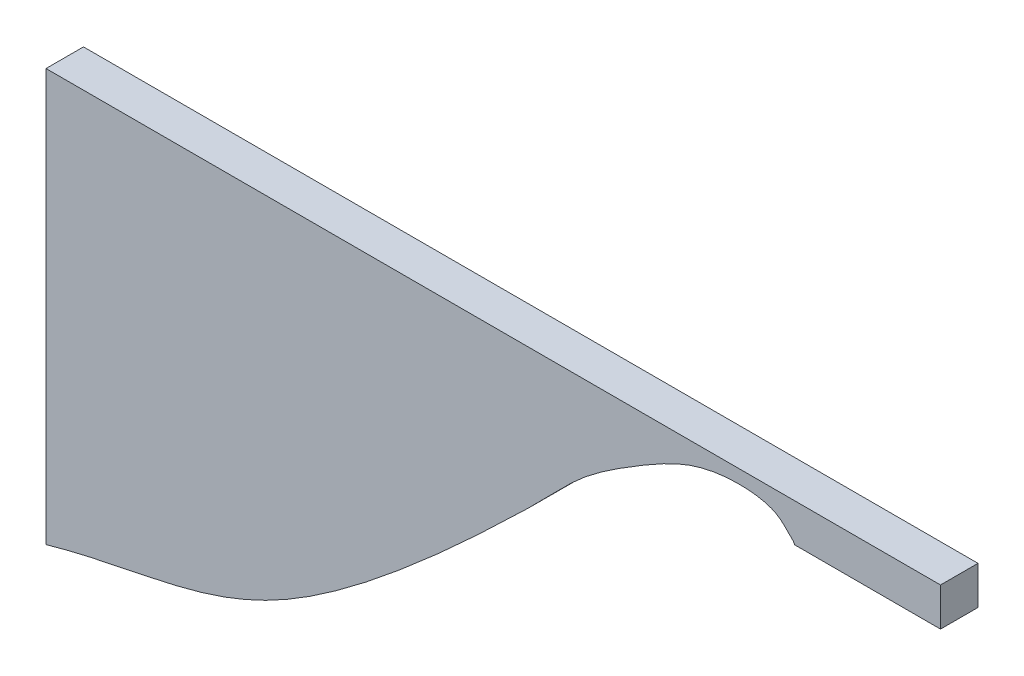
ISO-10303-21;
HEADER;
FILE_DESCRIPTION(('STEP AP214'),'2;1');
FILE_NAME('part.step','',(''),(''),'','','');
FILE_SCHEMA(('AUTOMOTIVE_DESIGN { 1 0 10303 214 1 1 1 1 }'));
ENDSEC;
DATA;
#1=APPLICATION_CONTEXT('core data for automotive mechanical design processes');
#2=APPLICATION_PROTOCOL_DEFINITION('international standard','automotive_design',2000,#1);
#3=PRODUCT_CONTEXT('',#1,'mechanical');
#4=PRODUCT('Part','Part','',(#3));
#5=PRODUCT_RELATED_PRODUCT_CATEGORY('part','',(#4));
#6=PRODUCT_DEFINITION_FORMATION('','',#4);
#7=PRODUCT_DEFINITION_CONTEXT('part definition',#1,'design');
#8=PRODUCT_DEFINITION('design','',#6,#7);
#9=PRODUCT_DEFINITION_SHAPE('','',#8);
#10=(LENGTH_UNIT() NAMED_UNIT(*) SI_UNIT(.MILLI.,.METRE.));
#11=(NAMED_UNIT(*) PLANE_ANGLE_UNIT() SI_UNIT($,.RADIAN.));
#12=(NAMED_UNIT(*) SI_UNIT($,.STERADIAN.) SOLID_ANGLE_UNIT());
#13=UNCERTAINTY_MEASURE_WITH_UNIT(LENGTH_MEASURE(1.E-05),#10,'distance_accuracy_value','');
#14=(GEOMETRIC_REPRESENTATION_CONTEXT(3) GLOBAL_UNCERTAINTY_ASSIGNED_CONTEXT((#13)) GLOBAL_UNIT_ASSIGNED_CONTEXT((#10,
#11,#12)) REPRESENTATION_CONTEXT('',''));
#15=CARTESIAN_POINT('',(0.,0.,0.));
#16=DIRECTION('',(0.,0.,1.));
#17=DIRECTION('',(1.,0.,0.));
#18=AXIS2_PLACEMENT_3D('',#15,#16,#17);
#19=CARTESIAN_POINT('',(20.559319102025,-41.7421375387278,75.9999999999997));
#20=CARTESIAN_POINT('',(20.6006217074475,-41.7303190899375,75.9999999999997));
#21=CARTESIAN_POINT('',(21.7372151884388,-41.4050908939655,75.9999999999997));
#22=CARTESIAN_POINT('',(23.9878346063018,-40.8228717307845,75.9999999999997));
#23=CARTESIAN_POINT('',(27.332073717808,-40.0909105868522,75.9999999999997));
#24=CARTESIAN_POINT('',(30.6910535632036,-39.4199065291348,75.9999999999997));
#25=CARTESIAN_POINT('',(33.4844463004313,-38.8300274329495,75.9999999999997));
#26=CARTESIAN_POINT('',(35.7012000162141,-38.2811197649488,75.9999999999997));
#27=CARTESIAN_POINT('',(37.9037494841531,-37.6635601670309,75.9999999999997));
#28=CARTESIAN_POINT('',(40.6078381788096,-36.7385237134709,75.9999999999997));
#29=CARTESIAN_POINT('',(43.7320659176392,-35.3550841305682,75.9999999999997));
#30=CARTESIAN_POINT('',(46.716341148628,-33.7303807225645,75.9999999999997));
#31=CARTESIAN_POINT('',(49.5743602868591,-31.9103389123185,75.9999999999997));
#32=CARTESIAN_POINT('',(52.3250104799769,-29.9612302924692,75.9999999999997));
#33=CARTESIAN_POINT('',(55.0253311147116,-27.8960074751916,75.9999999999997));
#34=CARTESIAN_POINT('',(57.6578897311373,-25.7609060268177,75.9999999999997));
#35=CARTESIAN_POINT('',(60.2703611817067,-23.540808031123,75.9999999999997));
#36=CARTESIAN_POINT('',(62.8206808546076,-21.2915983091942,75.9999999999997));
#37=CARTESIAN_POINT('',(65.3550419056114,-18.9883917300035,75.9999999999997));
#38=CARTESIAN_POINT('',(67.8417861936755,-16.6569401111582,75.9999999999997));
#39=CARTESIAN_POINT('',(70.3094579321987,-14.2943055515112,75.9999999999997));
#40=CARTESIAN_POINT('',(72.3581708472179,-12.3263559988564,75.9999999999997));
#41=CARTESIAN_POINT('',(73.9597288144003,-10.7134434786912,75.9999999999997));
#42=CARTESIAN_POINT('',(75.1420650382193,-9.48522361817299,75.9999999999997));
#43=CARTESIAN_POINT('',(76.1602599107097,-8.45200495256033,75.9999999999997));
#44=CARTESIAN_POINT('',(76.985126520713,-7.66991871319961,75.9999999999997));
#45=CARTESIAN_POINT('',(77.8365190180743,-6.91485000476222,75.9999999999997));
#46=CARTESIAN_POINT('',(78.9226177182861,-6.0400686966784,75.9999999999997));
#47=CARTESIAN_POINT('',(80.3127703908304,-5.04209480654106,75.9999999999997));
#48=CARTESIAN_POINT('',(81.7366435944141,-4.09984776240556,75.9999999999997));
#49=CARTESIAN_POINT('',(83.1791674923838,-3.1958957250793,75.9999999999997));
#50=CARTESIAN_POINT('',(84.6389909028154,-2.32327616364218,75.9999999999997));
#51=CARTESIAN_POINT('',(86.1167770611684,-1.48257705377303,75.9999999999997));
#52=CARTESIAN_POINT('',(87.6392489200758,-0.708072310431518,75.9999999999997));
#53=CARTESIAN_POINT('',(89.2189867414603,-0.0451010088743042,75.9999999999997));
#54=CARTESIAN_POINT('',(90.8670540227582,0.447543293336105,75.9999999999997));
#55=CARTESIAN_POINT('',(92.382394739987,0.709762770220839,75.9999999999997));
#56=CARTESIAN_POINT('',(93.7205904325718,0.823687266015985,75.9999999999997));
#57=CARTESIAN_POINT('',(94.86601460398,0.837907414862253,75.9999999999997));
#58=CARTESIAN_POINT('',(95.9052708510849,0.778478690490748,75.9999999999997));
#59=CARTESIAN_POINT('',(96.8423579537299,0.635582104006774,75.9999999999997));
#60=CARTESIAN_POINT('',(97.5785300541203,0.45866906976938,75.9999999999997));
#61=CARTESIAN_POINT('',(98.1994500099631,0.2263738790157,75.9999999999997));
#62=CARTESIAN_POINT('',(98.7059154621831,-0.0479029974733704,75.9999999999997));
#63=CARTESIAN_POINT('',(99.1245541376563,-0.384716253579125,75.9999999999997));
#64=CARTESIAN_POINT('',(99.4817263203403,-0.719519057276923,75.9999999999997));
#65=CARTESIAN_POINT('',(99.7877236757893,-1.0303144703227,75.9999999999997));
#66=CARTESIAN_POINT('',(100.10194671776,-1.33060624840962,75.9999999999997));
#67=CARTESIAN_POINT('',(100.316420526201,-1.56342967810508,75.9999999999997));
#68=CARTESIAN_POINT('',(100.419563255563,-1.73601542859504,75.9999999999997));
#69=CARTESIAN_POINT('',(100.443760155518,-1.78805572099269,75.9999999999997));
#70=CARTESIAN_POINT('',(100.457876590483,-1.81841594914382,75.9999999999997));
#71=B_SPLINE_CURVE_WITH_KNOTS('',3,(#19,#20,#21,#22,#23,#24,#25,#26,#27,#28,#29,#30,#31,#32,#33,
#34,#35,#36,#37,#38,#39,#40,#41,#42,#43,#44,#45,#46,#47,#48,#49,#50,#51,#52,#53,#54,#55,#56,#57,
#58,#59,#60,#61,#62,#63,#64,#65,#66,#67,#68,#69,#70),.UNSPECIFIED.,.F.,.F.,(4,1,1,1,1,1,1,1,1,1,
1,1,1,1,1,1,1,1,1,1,1,1,1,1,1,1,1,1,1,1,1,1,1,1,1,1,1,1,1,1,1,1,1,1,1,1,1,1,1,4),(0.,
0.00136819519714704,0.0376509357192509,0.0740080577145937,0.110383317331209,0.146744556294477,
0.164919006322866,0.183103967928642,0.219586990371093,0.25582641959623,0.291788252094461,
0.327698157547719,0.363676254535866,0.399123823190893,0.435948763609993,0.471614157704296,
0.508303560711362,0.544241284391034,0.580675886970789,0.616861052687893,0.653046262142758,
0.671143413698601,0.689246252347174,0.707342566004855,0.717335916614145,0.725440849475114,
0.743580082453329,0.761719013767892,0.779922778406146,0.797949441785808,0.815930962426998,
0.834085421618703,0.852087568652579,0.87030261788644,0.888573391712683,0.906742794178064,
0.919174502240224,0.931313296699129,0.94319923944882,0.952279071440183,0.961475305032942,
0.967253922037038,0.973352048519521,0.979726691778314,0.98430161806892,0.98894638683435,
0.993606190865411,0.998173477507026,0.998934409530482,1.),.UNSPECIFIED.);
#72=DIRECTION('',(0.,0.,1.));
#73=VECTOR('',#72,1.);
#74=SURFACE_OF_LINEAR_EXTRUSION('',#71,#73);
#75=CARTESIAN_POINT('',(100.457876590483,-1.81841594914382,79.9999999999997));
#76=CARTESIAN_POINT('',(100.443760155518,-1.78805572099269,79.9999999999997));
#77=CARTESIAN_POINT('',(100.419563255563,-1.73601542859504,79.9999999999997));
#78=CARTESIAN_POINT('',(100.316420526201,-1.56342967810508,79.9999999999997));
#79=CARTESIAN_POINT('',(100.10194671776,-1.33060624840962,79.9999999999997));
#80=CARTESIAN_POINT('',(99.7877236757893,-1.0303144703227,79.9999999999997));
#81=CARTESIAN_POINT('',(99.4817263203403,-0.719519057276923,79.9999999999997));
#82=CARTESIAN_POINT('',(99.1245541376563,-0.384716253579125,79.9999999999997));
#83=CARTESIAN_POINT('',(98.7059154621831,-0.0479029974733704,79.9999999999997));
#84=CARTESIAN_POINT('',(98.1994500099631,0.2263738790157,79.9999999999997));
#85=CARTESIAN_POINT('',(97.5785300541203,0.45866906976938,79.9999999999997));
#86=CARTESIAN_POINT('',(96.8423579537299,0.635582104006774,79.9999999999997));
#87=CARTESIAN_POINT('',(95.9052708510849,0.778478690490748,79.9999999999997));
#88=CARTESIAN_POINT('',(94.86601460398,0.837907414862253,79.9999999999997));
#89=CARTESIAN_POINT('',(93.7205904325718,0.823687266015985,79.9999999999997));
#90=CARTESIAN_POINT('',(92.382394739987,0.709762770220839,79.9999999999997));
#91=CARTESIAN_POINT('',(90.8670540227582,0.447543293336105,79.9999999999997));
#92=CARTESIAN_POINT('',(89.2189867414603,-0.0451010088743042,79.9999999999997));
#93=CARTESIAN_POINT('',(87.6392489200758,-0.708072310431518,79.9999999999997));
#94=CARTESIAN_POINT('',(86.1167770611684,-1.48257705377303,79.9999999999997));
#95=CARTESIAN_POINT('',(84.6389909028154,-2.32327616364218,79.9999999999997));
#96=CARTESIAN_POINT('',(83.1791674923838,-3.1958957250793,79.9999999999997));
#97=CARTESIAN_POINT('',(81.7366435944141,-4.09984776240556,79.9999999999997));
#98=CARTESIAN_POINT('',(80.3127703908304,-5.04209480654106,79.9999999999997));
#99=CARTESIAN_POINT('',(78.9226177182861,-6.0400686966784,79.9999999999997));
#100=CARTESIAN_POINT('',(77.8365190180743,-6.91485000476222,79.9999999999997));
#101=CARTESIAN_POINT('',(76.985126520713,-7.66991871319961,79.9999999999997));
#102=CARTESIAN_POINT('',(76.1602599107097,-8.45200495256033,79.9999999999997));
#103=CARTESIAN_POINT('',(75.1420650382193,-9.48522361817299,79.9999999999997));
#104=CARTESIAN_POINT('',(73.9597288144003,-10.7134434786912,79.9999999999997));
#105=CARTESIAN_POINT('',(72.3581708472179,-12.3263559988564,79.9999999999997));
#106=CARTESIAN_POINT('',(70.3094579321987,-14.2943055515112,79.9999999999997));
#107=CARTESIAN_POINT('',(67.8417861936755,-16.6569401111582,79.9999999999997));
#108=CARTESIAN_POINT('',(65.3550419056114,-18.9883917300035,79.9999999999997));
#109=CARTESIAN_POINT('',(62.8206808546076,-21.2915983091942,79.9999999999997));
#110=CARTESIAN_POINT('',(60.2703611817067,-23.540808031123,79.9999999999997));
#111=CARTESIAN_POINT('',(57.6578897311373,-25.7609060268177,79.9999999999997));
#112=CARTESIAN_POINT('',(55.0253311147116,-27.8960074751916,79.9999999999997));
#113=CARTESIAN_POINT('',(52.3250104799769,-29.9612302924692,79.9999999999997));
#114=CARTESIAN_POINT('',(49.5743602868591,-31.9103389123185,79.9999999999997));
#115=CARTESIAN_POINT('',(46.716341148628,-33.7303807225645,79.9999999999997));
#116=CARTESIAN_POINT('',(43.7320659176392,-35.3550841305682,79.9999999999997));
#117=CARTESIAN_POINT('',(40.6078381788096,-36.7385237134709,79.9999999999997));
#118=CARTESIAN_POINT('',(37.9037494841531,-37.6635601670309,79.9999999999997));
#119=CARTESIAN_POINT('',(35.7012000162141,-38.2811197649488,79.9999999999997));
#120=CARTESIAN_POINT('',(33.4844463004313,-38.8300274329495,79.9999999999997));
#121=CARTESIAN_POINT('',(30.6910535632036,-39.4199065291348,79.9999999999997));
#122=CARTESIAN_POINT('',(27.332073717808,-40.0909105868522,79.9999999999997));
#123=CARTESIAN_POINT('',(23.9878346063018,-40.8228717307845,79.9999999999997));
#124=CARTESIAN_POINT('',(21.7372151884388,-41.4050908939655,79.9999999999997));
#125=CARTESIAN_POINT('',(20.6006217074475,-41.7303190899375,79.9999999999997));
#126=CARTESIAN_POINT('',(20.559319102025,-41.7421375387278,79.9999999999997));
#127=B_SPLINE_CURVE_WITH_KNOTS('',3,(#75,#76,#77,#78,#79,#80,#81,#82,#83,#84,#85,#86,#87,#88,
#89,#90,#91,#92,#93,#94,#95,#96,#97,#98,#99,#100,#101,#102,#103,#104,#105,#106,#107,#108,#109,
#110,#111,#112,#113,#114,#115,#116,#117,#118,#119,#120,#121,#122,#123,#124,#125,#126),
.UNSPECIFIED.,.F.,.F.,(4,1,1,1,1,1,1,1,1,1,1,1,1,1,1,1,1,1,1,1,1,1,1,1,1,1,1,1,1,1,1,1,1,1,1,1,
1,1,1,1,1,1,1,1,1,1,1,1,1,4),(0.,0.00106559046951848,0.00182652249297421,0.00639380913458854,
0.0110536131656501,0.0156983819310799,0.0202733082216865,0.0266479514804794,0.0327460779629625,
0.0385246949670581,0.0477209285598175,0.0568007605511803,0.0686867033008713,0.0808254977597758,
0.0932572058219363,0.111426608287317,0.12969738211356,0.147912431347421,0.165914578381297,
0.184069037573002,0.202050558214192,0.220077221593854,0.238280986232108,0.256419917546671,
0.274559150524886,0.282664083385855,0.292657433995145,0.310753747652826,0.328856586301399,
0.346953737857242,0.383138947312107,0.419324113029211,0.455758715608966,0.491696439288638,
0.528385842295704,0.564051236390007,0.600876176809107,0.636323745464134,0.672301842452281,
0.708211747905539,0.74417358040377,0.780413009628907,0.816896032071358,0.835080993677134,
0.853255443705523,0.889616682668791,0.925991942285406,0.962349064280749,0.998631804802853,1.),.UNSPECIFIED.);
#128=CARTESIAN_POINT('',(20.559319102025,-41.7421375387278,79.9999999999997));
#129=VERTEX_POINT('',#128);
#130=CARTESIAN_POINT('',(100.457876590483,-1.81841594914382,79.9999999999997));
#131=VERTEX_POINT('',#130);
#132=EDGE_CURVE('E161',#129,#131,#127,.F.);
#133=ORIENTED_EDGE('',*,*,#132,.F.);
#134=DIRECTION('',(0.,0.,1.));
#135=VECTOR('',#134,1.);
#136=CARTESIAN_POINT('',(20.559319102025,-41.7421375387278,75.9999999999997));
#137=LINE('',#136,#135);
#138=CARTESIAN_POINT('',(20.559319102025,-41.7421375387278,75.9999999999997));
#139=VERTEX_POINT('',#138);
#140=EDGE_CURVE('E11',#139,#129,#137,.T.);
#141=ORIENTED_EDGE('',*,*,#140,.F.);
#142=CARTESIAN_POINT('',(20.559319102025,-41.7421375387278,75.9999999999997));
#143=CARTESIAN_POINT('',(20.6006217074475,-41.7303190899375,75.9999999999997));
#144=CARTESIAN_POINT('',(21.7372151884388,-41.4050908939655,75.9999999999997));
#145=CARTESIAN_POINT('',(23.9878346063018,-40.8228717307845,75.9999999999997));
#146=CARTESIAN_POINT('',(27.332073717808,-40.0909105868522,75.9999999999997));
#147=CARTESIAN_POINT('',(30.6910535632036,-39.4199065291348,75.9999999999997));
#148=CARTESIAN_POINT('',(33.4844463004313,-38.8300274329495,75.9999999999997));
#149=CARTESIAN_POINT('',(35.7012000162141,-38.2811197649488,75.9999999999997));
#150=CARTESIAN_POINT('',(37.9037494841531,-37.6635601670309,75.9999999999997));
#151=CARTESIAN_POINT('',(40.6078381788096,-36.7385237134709,75.9999999999997));
#152=CARTESIAN_POINT('',(43.7320659176392,-35.3550841305682,75.9999999999997));
#153=CARTESIAN_POINT('',(46.716341148628,-33.7303807225645,75.9999999999997));
#154=CARTESIAN_POINT('',(49.5743602868591,-31.9103389123185,75.9999999999997));
#155=CARTESIAN_POINT('',(52.3250104799769,-29.9612302924692,75.9999999999997));
#156=CARTESIAN_POINT('',(55.0253311147116,-27.8960074751916,75.9999999999997));
#157=CARTESIAN_POINT('',(57.6578897311373,-25.7609060268177,75.9999999999997));
#158=CARTESIAN_POINT('',(60.2703611817067,-23.540808031123,75.9999999999997));
#159=CARTESIAN_POINT('',(62.8206808546076,-21.2915983091942,75.9999999999997));
#160=CARTESIAN_POINT('',(65.3550419056114,-18.9883917300035,75.9999999999997));
#161=CARTESIAN_POINT('',(67.8417861936755,-16.6569401111582,75.9999999999997));
#162=CARTESIAN_POINT('',(70.3094579321987,-14.2943055515112,75.9999999999997));
#163=CARTESIAN_POINT('',(72.3581708472179,-12.3263559988564,75.9999999999997));
#164=CARTESIAN_POINT('',(73.9597288144003,-10.7134434786912,75.9999999999997));
#165=CARTESIAN_POINT('',(75.1420650382193,-9.48522361817299,75.9999999999997));
#166=CARTESIAN_POINT('',(76.1602599107097,-8.45200495256033,75.9999999999997));
#167=CARTESIAN_POINT('',(76.985126520713,-7.66991871319961,75.9999999999997));
#168=CARTESIAN_POINT('',(77.8365190180743,-6.91485000476222,75.9999999999997));
#169=CARTESIAN_POINT('',(78.9226177182861,-6.0400686966784,75.9999999999997));
#170=CARTESIAN_POINT('',(80.3127703908304,-5.04209480654106,75.9999999999997));
#171=CARTESIAN_POINT('',(81.7366435944141,-4.09984776240556,75.9999999999997));
#172=CARTESIAN_POINT('',(83.1791674923838,-3.1958957250793,75.9999999999997));
#173=CARTESIAN_POINT('',(84.6389909028154,-2.32327616364218,75.9999999999997));
#174=CARTESIAN_POINT('',(86.1167770611684,-1.48257705377303,75.9999999999997));
#175=CARTESIAN_POINT('',(87.6392489200758,-0.708072310431518,75.9999999999997));
#176=CARTESIAN_POINT('',(89.2189867414603,-0.0451010088743042,75.9999999999997));
#177=CARTESIAN_POINT('',(90.8670540227582,0.447543293336105,75.9999999999997));
#178=CARTESIAN_POINT('',(92.382394739987,0.709762770220839,75.9999999999997));
#179=CARTESIAN_POINT('',(93.7205904325718,0.823687266015985,75.9999999999997));
#180=CARTESIAN_POINT('',(94.86601460398,0.837907414862253,75.9999999999997));
#181=CARTESIAN_POINT('',(95.9052708510849,0.778478690490748,75.9999999999997));
#182=CARTESIAN_POINT('',(96.8423579537299,0.635582104006774,75.9999999999997));
#183=CARTESIAN_POINT('',(97.5785300541203,0.45866906976938,75.9999999999997));
#184=CARTESIAN_POINT('',(98.1994500099631,0.2263738790157,75.9999999999997));
#185=CARTESIAN_POINT('',(98.7059154621831,-0.0479029974733704,75.9999999999997));
#186=CARTESIAN_POINT('',(99.1245541376563,-0.384716253579125,75.9999999999997));
#187=CARTESIAN_POINT('',(99.4817263203403,-0.719519057276923,75.9999999999997));
#188=CARTESIAN_POINT('',(99.7877236757893,-1.0303144703227,75.9999999999997));
#189=CARTESIAN_POINT('',(100.10194671776,-1.33060624840962,75.9999999999997));
#190=CARTESIAN_POINT('',(100.316420526201,-1.56342967810508,75.9999999999997));
#191=CARTESIAN_POINT('',(100.419563255563,-1.73601542859504,75.9999999999997));
#192=CARTESIAN_POINT('',(100.443760155518,-1.78805572099269,75.9999999999997));
#193=CARTESIAN_POINT('',(100.457876590483,-1.81841594914382,75.9999999999997));
#194=B_SPLINE_CURVE_WITH_KNOTS('',3,(#142,#143,#144,#145,#146,#147,#148,#149,#150,#151,#152,
#153,#154,#155,#156,#157,#158,#159,#160,#161,#162,#163,#164,#165,#166,#167,#168,#169,#170,#171,
#172,#173,#174,#175,#176,#177,#178,#179,#180,#181,#182,#183,#184,#185,#186,#187,#188,#189,#190,
#191,#192,#193),.UNSPECIFIED.,.F.,.F.,(4,1,1,1,1,1,1,1,1,1,1,1,1,1,1,1,1,1,1,1,1,1,1,1,1,1,1,1,
1,1,1,1,1,1,1,1,1,1,1,1,1,1,1,1,1,1,1,1,1,4),(0.,0.00136819519714704,0.0376509357192509,
0.0740080577145937,0.110383317331209,0.146744556294477,0.164919006322866,0.183103967928642,
0.219586990371093,0.25582641959623,0.291788252094461,0.327698157547719,0.363676254535866,
0.399123823190893,0.435948763609993,0.471614157704296,0.508303560711362,0.544241284391034,
0.580675886970789,0.616861052687893,0.653046262142758,0.671143413698601,0.689246252347174,
0.707342566004855,0.717335916614145,0.725440849475114,0.743580082453329,0.761719013767892,
0.779922778406146,0.797949441785808,0.815930962426998,0.834085421618703,0.852087568652579,
0.87030261788644,0.888573391712683,0.906742794178064,0.919174502240224,0.931313296699129,
0.94319923944882,0.952279071440183,0.961475305032942,0.967253922037038,0.973352048519521,
0.979726691778314,0.98430161806892,0.98894638683435,0.993606190865411,0.998173477507026,
0.998934409530482,1.),.UNSPECIFIED.);
#195=CARTESIAN_POINT('',(100.457876590483,-1.81841594914382,75.9999999999997));
#196=VERTEX_POINT('',#195);
#197=EDGE_CURVE('E105',#139,#196,#194,.T.);
#198=ORIENTED_EDGE('',*,*,#197,.T.);
#199=DIRECTION('',(0.,0.,1.));
#200=VECTOR('',#199,1.);
#201=CARTESIAN_POINT('',(100.457876590483,-1.81841594914382,75.9999999999997));
#202=LINE('',#201,#200);
#203=EDGE_CURVE('E79',#196,#131,#202,.T.);
#204=ORIENTED_EDGE('',*,*,#203,.T.);
#205=EDGE_LOOP('',(#133,#141,#198,#204));
#206=FACE_BOUND('',#205,.T.);
#207=ADVANCED_FACE('F30',(#206),#74,.T.);
#208=CARTESIAN_POINT('',(20.559319102025,-41.7421375387278,75.9999999999997));
#209=DIRECTION('',(-0.999999999957917,-9.1741956724542E-06,0.));
#210=DIRECTION('',(9.1741956724542E-06,-0.999999999957917,0.));
#211=AXIS2_PLACEMENT_3D('',#208,#209,#210);
#212=PLANE('',#211);
#213=DIRECTION('',(9.1741956724542E-06,-0.999999999957917,0.));
#214=VECTOR('',#213,1.);
#215=CARTESIAN_POINT('',(20.559319102025,-41.7421375387278,79.9999999999997));
#216=LINE('',#215,#214);
#217=CARTESIAN_POINT('',(20.5589154545019,2.25600000000003,79.9999999999997));
#218=VERTEX_POINT('',#217);
#219=EDGE_CURVE('E115',#218,#129,#216,.T.);
#220=ORIENTED_EDGE('',*,*,#219,.F.);
#221=DIRECTION('',(0.,0.,1.));
#222=VECTOR('',#221,1.);
#223=CARTESIAN_POINT('',(20.5589154545019,2.25600000000003,75.9999999999997));
#224=LINE('',#223,#222);
#225=CARTESIAN_POINT('',(20.5589154545019,2.25600000000003,75.9999999999997));
#226=VERTEX_POINT('',#225);
#227=EDGE_CURVE('E41',#226,#218,#224,.T.);
#228=ORIENTED_EDGE('',*,*,#227,.F.);
#229=DIRECTION('',(9.1741956724542E-06,-0.999999999957917,0.));
#230=VECTOR('',#229,1.);
#231=CARTESIAN_POINT('',(20.559319102025,-41.7421375387278,75.9999999999997));
#232=LINE('',#231,#230);
#233=EDGE_CURVE('E100',#226,#139,#232,.T.);
#234=ORIENTED_EDGE('',*,*,#233,.T.);
#235=ORIENTED_EDGE('',*,*,#140,.T.);
#236=EDGE_LOOP('',(#220,#228,#234,#235));
#237=FACE_BOUND('',#236,.T.);
#238=ADVANCED_FACE('F146',(#237),#212,.T.);
#239=CARTESIAN_POINT('',(20.5589154545019,2.25600000000003,75.9999999999997));
#240=DIRECTION('',(0.,1.,0.));
#241=DIRECTION('',(-1.,0.,0.));
#242=AXIS2_PLACEMENT_3D('',#239,#240,#241);
#243=PLANE('',#242);
#244=DIRECTION('',(-1.,0.,0.));
#245=VECTOR('',#244,1.);
#246=CARTESIAN_POINT('',(20.5589154545019,2.25600000000003,79.9999999999997));
#247=LINE('',#246,#245);
#248=CARTESIAN_POINT('',(116.011029140805,2.25600000000004,79.9999999999997));
#249=VERTEX_POINT('',#248);
#250=EDGE_CURVE('E89',#249,#218,#247,.T.);
#251=ORIENTED_EDGE('',*,*,#250,.F.);
#252=DIRECTION('',(0.,0.,1.));
#253=VECTOR('',#252,1.);
#254=CARTESIAN_POINT('',(116.011029140805,2.25600000000004,75.9999999999997));
#255=LINE('',#254,#253);
#256=CARTESIAN_POINT('',(116.011029140805,2.25600000000004,75.9999999999997));
#257=VERTEX_POINT('',#256);
#258=EDGE_CURVE('E84',#257,#249,#255,.T.);
#259=ORIENTED_EDGE('',*,*,#258,.F.);
#260=DIRECTION('',(-1.,0.,0.));
#261=VECTOR('',#260,1.);
#262=CARTESIAN_POINT('',(20.5589154545019,2.25600000000003,75.9999999999997));
#263=LINE('',#262,#261);
#264=EDGE_CURVE('E87',#257,#226,#263,.T.);
#265=ORIENTED_EDGE('',*,*,#264,.T.);
#266=ORIENTED_EDGE('',*,*,#227,.T.);
#267=EDGE_LOOP('',(#251,#259,#265,#266));
#268=FACE_BOUND('',#267,.T.);
#269=ADVANCED_FACE('F86',(#268),#243,.T.);
#270=CARTESIAN_POINT('',(116.011029140805,2.25600000000004,75.9999999999997));
#271=DIRECTION('',(1.,0.,0.));
#272=DIRECTION('',(0.,1.,0.));
#273=AXIS2_PLACEMENT_3D('',#270,#271,#272);
#274=PLANE('',#273);
#275=DIRECTION('',(0.,1.,0.));
#276=VECTOR('',#275,1.);
#277=CARTESIAN_POINT('',(116.011029140805,2.25600000000004,79.9999999999997));
#278=LINE('',#277,#276);
#279=CARTESIAN_POINT('',(116.011029140805,-1.82637328766154,79.9999999999997));
#280=VERTEX_POINT('',#279);
#281=EDGE_CURVE('E111',#280,#249,#278,.T.);
#282=ORIENTED_EDGE('',*,*,#281,.F.);
#283=DIRECTION('',(0.,0.,1.));
#284=VECTOR('',#283,1.);
#285=CARTESIAN_POINT('',(116.011029140805,-1.82637328766154,75.9999999999997));
#286=LINE('',#285,#284);
#287=CARTESIAN_POINT('',(116.011029140805,-1.82637328766154,75.9999999999997));
#288=VERTEX_POINT('',#287);
#289=EDGE_CURVE('E94',#288,#280,#286,.T.);
#290=ORIENTED_EDGE('',*,*,#289,.F.);
#291=DIRECTION('',(0.,1.,0.));
#292=VECTOR('',#291,1.);
#293=CARTESIAN_POINT('',(116.011029140805,2.25600000000004,75.9999999999997));
#294=LINE('',#293,#292);
#295=EDGE_CURVE('E99',#288,#257,#294,.T.);
#296=ORIENTED_EDGE('',*,*,#295,.T.);
#297=ORIENTED_EDGE('',*,*,#258,.T.);
#298=EDGE_LOOP('',(#282,#290,#296,#297));
#299=FACE_BOUND('',#298,.T.);
#300=ADVANCED_FACE('F102',(#299),#274,.T.);
#301=CARTESIAN_POINT('',(100.457876590483,-1.81841594914382,75.9999999999997));
#302=DIRECTION('',(-0.000511622158306754,-0.999999869121375,0.));
#303=DIRECTION('',(0.999999869121375,-0.000511622158306754,0.));
#304=AXIS2_PLACEMENT_3D('',#301,#302,#303);
#305=PLANE('',#304);
#306=DIRECTION('',(0.999999869121375,-0.000511622158306754,0.));
#307=VECTOR('',#306,1.);
#308=CARTESIAN_POINT('',(100.457876590483,-1.81841594914382,79.9999999999997));
#309=LINE('',#308,#307);
#310=EDGE_CURVE('E113',#131,#280,#309,.T.);
#311=ORIENTED_EDGE('',*,*,#310,.F.);
#312=ORIENTED_EDGE('',*,*,#203,.F.);
#313=DIRECTION('',(0.999999869121375,-0.000511622158306754,0.));
#314=VECTOR('',#313,1.);
#315=CARTESIAN_POINT('',(100.457876590483,-1.81841594914382,75.9999999999997));
#316=LINE('',#315,#314);
#317=EDGE_CURVE('E103',#196,#288,#316,.T.);
#318=ORIENTED_EDGE('',*,*,#317,.T.);
#319=ORIENTED_EDGE('',*,*,#289,.T.);
#320=EDGE_LOOP('',(#311,#312,#318,#319));
#321=FACE_BOUND('',#320,.T.);
#322=ADVANCED_FACE('F141',(#321),#305,.T.);
#323=CARTESIAN_POINT('',(62.2489662515434,-21.7902887569091,75.9999999999997));
#324=DIRECTION('',(0.,0.,-1.));
#325=DIRECTION('',(-1.,0.,0.));
#326=AXIS2_PLACEMENT_3D('',#323,#324,#325);
#327=PLANE('',#326);
#328=ORIENTED_EDGE('',*,*,#197,.F.);
#329=ORIENTED_EDGE('',*,*,#233,.F.);
#330=ORIENTED_EDGE('',*,*,#264,.F.);
#331=ORIENTED_EDGE('',*,*,#295,.F.);
#332=ORIENTED_EDGE('',*,*,#317,.F.);
#333=EDGE_LOOP('',(#328,#329,#330,#331,#332));
#334=FACE_BOUND('',#333,.T.);
#335=ADVANCED_FACE('F98',(#334),#327,.T.);
#336=CARTESIAN_POINT('',(62.2489662515434,-21.7902887569091,79.9999999999997));
#337=DIRECTION('',(0.,0.,-1.));
#338=DIRECTION('',(-1.,0.,0.));
#339=AXIS2_PLACEMENT_3D('',#336,#337,#338);
#340=PLANE('',#339);
#341=ORIENTED_EDGE('',*,*,#132,.T.);
#342=ORIENTED_EDGE('',*,*,#310,.T.);
#343=ORIENTED_EDGE('',*,*,#281,.T.);
#344=ORIENTED_EDGE('',*,*,#250,.T.);
#345=ORIENTED_EDGE('',*,*,#219,.T.);
#346=EDGE_LOOP('',(#341,#342,#343,#344,#345));
#347=FACE_BOUND('',#346,.T.);
#348=ADVANCED_FACE('F140',(#347),#340,.F.);
#349=CLOSED_SHELL('',(#207,#238,#269,#300,#322,#335,#348));
#350=MANIFOLD_SOLID_BREP('B2',#349);
#351=ADVANCED_BREP_SHAPE_REPRESENTATION('',(#18,#350),#14);
#352=SHAPE_DEFINITION_REPRESENTATION(#9,#351);
ENDSEC;
END-ISO-10303-21;
